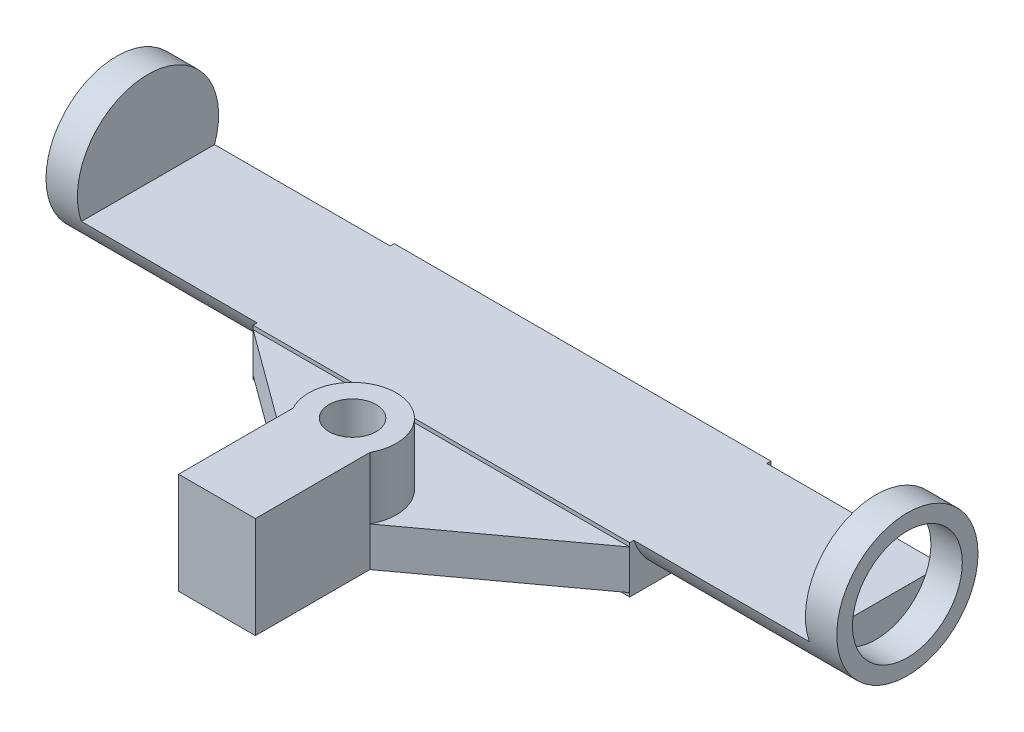
ISO-10303-21;
HEADER;
FILE_DESCRIPTION(('STEP AP214'),'2;1');
FILE_NAME('part.step','',(''),(''),'','','');
FILE_SCHEMA(('AUTOMOTIVE_DESIGN { 1 0 10303 214 1 1 1 1 }'));
ENDSEC;
DATA;
#1=APPLICATION_CONTEXT('core data for automotive mechanical design processes');
#2=APPLICATION_PROTOCOL_DEFINITION('international standard','automotive_design',2000,#1);
#3=PRODUCT_CONTEXT('',#1,'mechanical');
#4=PRODUCT('Part','Part','',(#3));
#5=PRODUCT_RELATED_PRODUCT_CATEGORY('part','',(#4));
#6=PRODUCT_DEFINITION_FORMATION('','',#4);
#7=PRODUCT_DEFINITION_CONTEXT('part definition',#1,'design');
#8=PRODUCT_DEFINITION('design','',#6,#7);
#9=PRODUCT_DEFINITION_SHAPE('','',#8);
#10=(LENGTH_UNIT() NAMED_UNIT(*) SI_UNIT(.MILLI.,.METRE.));
#11=(NAMED_UNIT(*) PLANE_ANGLE_UNIT() SI_UNIT($,.RADIAN.));
#12=(NAMED_UNIT(*) SI_UNIT($,.STERADIAN.) SOLID_ANGLE_UNIT());
#13=UNCERTAINTY_MEASURE_WITH_UNIT(LENGTH_MEASURE(1.E-05),#10,'distance_accuracy_value','');
#14=(GEOMETRIC_REPRESENTATION_CONTEXT(3) GLOBAL_UNCERTAINTY_ASSIGNED_CONTEXT((#13)) GLOBAL_UNIT_ASSIGNED_CONTEXT((#10,
#11,#12)) REPRESENTATION_CONTEXT('',''));
#15=CARTESIAN_POINT('',(0.,0.,0.));
#16=DIRECTION('',(0.,0.,1.));
#17=DIRECTION('',(1.,0.,0.));
#18=AXIS2_PLACEMENT_3D('',#15,#16,#17);
#19=CARTESIAN_POINT('',(59.217620347765,28.575,23.8423003272837));
#20=DIRECTION('',(0.,0.,-1.));
#21=DIRECTION('',(-1.,0.,0.));
#22=AXIS2_PLACEMENT_3D('',#19,#20,#21);
#23=PLANE('',#22);
#24=DIRECTION('',(0.,1.,0.));
#25=VECTOR('',#24,1.);
#26=CARTESIAN_POINT('',(-58.882379652235,28.575,23.8423003272837));
#27=LINE('',#26,#25);
#28=CARTESIAN_POINT('',(-58.882379652235,0.,23.8423003272837));
#29=VERTEX_POINT('',#28);
#30=CARTESIAN_POINT('',(-58.882379652235,0.762500000000017,23.8423003272837));
#31=VERTEX_POINT('',#30);
#32=EDGE_CURVE('E327',#29,#31,#27,.T.);
#33=ORIENTED_EDGE('',*,*,#32,.F.);
#34=DIRECTION('',(1.,0.,0.));
#35=VECTOR('',#34,1.);
#36=CARTESIAN_POINT('',(59.217620347765,0.,23.8423003272837));
#37=LINE('',#36,#35);
#38=CARTESIAN_POINT('',(17.317620347765,0.,23.8423003272837));
#39=VERTEX_POINT('',#38);
#40=EDGE_CURVE('E187',#29,#39,#37,.T.);
#41=ORIENTED_EDGE('',*,*,#40,.T.);
#42=DIRECTION('',(0.,-1.,0.));
#43=VECTOR('',#42,1.);
#44=CARTESIAN_POINT('',(17.317620347765,28.575,23.8423003272837));
#45=LINE('',#44,#43);
#46=CARTESIAN_POINT('',(17.317620347765,0.762500000000024,23.8423003272837));
#47=VERTEX_POINT('',#46);
#48=EDGE_CURVE('E216',#47,#39,#45,.T.);
#49=ORIENTED_EDGE('',*,*,#48,.F.);
#50=DIRECTION('',(1.,0.,0.));
#51=VECTOR('',#50,1.);
#52=CARTESIAN_POINT('',(17.317620347765,0.762500000000026,23.8423003272837));
#53=LINE('',#52,#51);
#54=EDGE_CURVE('E285',#31,#47,#53,.T.);
#55=ORIENTED_EDGE('',*,*,#54,.F.);
#56=EDGE_LOOP('',(#33,#41,#49,#55));
#57=FACE_BOUND('',#56,.T.);
#58=ADVANCED_FACE('F35',(#57),#23,.F.);
#59=CARTESIAN_POINT('',(-58.882379652235,8.76250000000002,23.8423003272837));
#60=VERTEX_POINT('',#59);
#61=CARTESIAN_POINT('',(-58.882379652235,9.525,23.8423003272837));
#62=VERTEX_POINT('',#61);
#63=EDGE_CURVE('E303',#60,#62,#27,.T.);
#64=ORIENTED_EDGE('',*,*,#63,.F.);
#65=DIRECTION('',(-1.,0.,0.));
#66=VECTOR('',#65,1.);
#67=CARTESIAN_POINT('',(17.317620347765,8.76250000000003,23.8423003272837));
#68=LINE('',#67,#66);
#69=CARTESIAN_POINT('',(17.317620347765,8.76250000000003,23.8423003272837));
#70=VERTEX_POINT('',#69);
#71=EDGE_CURVE('E282',#70,#60,#68,.T.);
#72=ORIENTED_EDGE('',*,*,#71,.F.);
#73=CARTESIAN_POINT('',(17.317620347765,9.525,23.8423003272837));
#74=VERTEX_POINT('',#73);
#75=EDGE_CURVE('E220',#74,#70,#45,.T.);
#76=ORIENTED_EDGE('',*,*,#75,.F.);
#77=DIRECTION('',(1.,0.,0.));
#78=VECTOR('',#77,1.);
#79=CARTESIAN_POINT('',(-94.432379652235,9.525,23.8423003272837));
#80=LINE('',#79,#78);
#81=EDGE_CURVE('E173',#62,#74,#80,.T.);
#82=ORIENTED_EDGE('',*,*,#81,.F.);
#83=EDGE_LOOP('',(#64,#72,#76,#82));
#84=FACE_BOUND('',#83,.T.);
#85=ADVANCED_FACE('F301',(#84),#23,.F.);
#86=CARTESIAN_POINT('',(59.217620347765,28.575,-4.73269967271635));
#87=DIRECTION('',(0.,0.,1.));
#88=DIRECTION('',(1.,0.,0.));
#89=AXIS2_PLACEMENT_3D('',#86,#87,#88);
#90=PLANE('',#89);
#91=DIRECTION('',(0.,-1.,0.));
#92=VECTOR('',#91,1.);
#93=CARTESIAN_POINT('',(-58.882379652235,28.575,-4.73269967271634));
#94=LINE('',#93,#92);
#95=CARTESIAN_POINT('',(-58.882379652235,9.525,-4.73269967271635));
#96=VERTEX_POINT('',#95);
#97=CARTESIAN_POINT('',(-58.882379652235,0.,-4.73269967271634));
#98=VERTEX_POINT('',#97);
#99=EDGE_CURVE('E341',#96,#98,#94,.T.);
#100=ORIENTED_EDGE('',*,*,#99,.F.);
#101=DIRECTION('',(-1.,0.,0.));
#102=VECTOR('',#101,1.);
#103=CARTESIAN_POINT('',(-94.432379652235,9.525,-4.73269967271635));
#104=LINE('',#103,#102);
#105=CARTESIAN_POINT('',(17.317620347765,9.525,-4.73269967271635));
#106=VERTEX_POINT('',#105);
#107=EDGE_CURVE('E179',#106,#96,#104,.T.);
#108=ORIENTED_EDGE('',*,*,#107,.F.);
#109=DIRECTION('',(0.,1.,0.));
#110=VECTOR('',#109,1.);
#111=CARTESIAN_POINT('',(17.317620347765,28.575,-4.73269967271635));
#112=LINE('',#111,#110);
#113=CARTESIAN_POINT('',(17.317620347765,0.,-4.73269967271635));
#114=VERTEX_POINT('',#113);
#115=EDGE_CURVE('E230',#114,#106,#112,.T.);
#116=ORIENTED_EDGE('',*,*,#115,.F.);
#117=DIRECTION('',(-1.,0.,0.));
#118=VECTOR('',#117,1.);
#119=CARTESIAN_POINT('',(59.217620347765,0.,-4.73269967271635));
#120=LINE('',#119,#118);
#121=EDGE_CURVE('E184',#114,#98,#120,.T.);
#122=ORIENTED_EDGE('',*,*,#121,.T.);
#123=EDGE_LOOP('',(#100,#108,#116,#122));
#124=FACE_BOUND('',#123,.T.);
#125=ADVANCED_FACE('F340',(#124),#90,.F.);
#126=CARTESIAN_POINT('',(0.,0.,0.));
#127=DIRECTION('',(0.,1.,0.));
#128=DIRECTION('',(0.,0.,1.));
#129=AXIS2_PLACEMENT_3D('',#126,#127,#128);
#130=PLANE('',#129);
#131=DIRECTION('',(0.,0.,1.));
#132=VECTOR('',#131,1.);
#133=CARTESIAN_POINT('',(-58.882379652235,0.,0.));
#134=LINE('',#133,#132);
#135=CARTESIAN_POINT('',(-58.882379652235,0.,9.55480032728367));
#136=VERTEX_POINT('',#135);
#137=EDGE_CURVE('E347',#98,#136,#134,.T.);
#138=ORIENTED_EDGE('',*,*,#137,.F.);
#139=ORIENTED_EDGE('',*,*,#121,.F.);
#140=DIRECTION('',(0.,0.,-1.));
#141=VECTOR('',#140,1.);
#142=CARTESIAN_POINT('',(17.317620347765,0.,0.));
#143=LINE('',#142,#141);
#144=CARTESIAN_POINT('',(17.317620347765,0.,9.55480032728365));
#145=VERTEX_POINT('',#144);
#146=EDGE_CURVE('E229',#145,#114,#143,.T.);
#147=ORIENTED_EDGE('',*,*,#146,.F.);
#148=EDGE_CURVE('E214',#39,#145,#143,.T.);
#149=ORIENTED_EDGE('',*,*,#148,.F.);
#150=ORIENTED_EDGE('',*,*,#40,.F.);
#151=EDGE_CURVE('E352',#136,#29,#134,.T.);
#152=ORIENTED_EDGE('',*,*,#151,.F.);
#153=EDGE_LOOP('',(#138,#139,#147,#149,#150,#152));
#154=FACE_BOUND('',#153,.T.);
#155=ADVANCED_FACE('F331',(#154),#130,.F.);
#156=CARTESIAN_POINT('',(0.,9.525,0.));
#157=DIRECTION('',(0.,1.,0.));
#158=DIRECTION('',(0.,0.,1.));
#159=AXIS2_PLACEMENT_3D('',#156,#157,#158);
#160=PLANE('',#159);
#161=ORIENTED_EDGE('',*,*,#107,.T.);
#162=DIRECTION('',(0.,0.,1.));
#163=VECTOR('',#162,1.);
#164=CARTESIAN_POINT('',(-58.882379652235,9.525,0.));
#165=LINE('',#164,#163);
#166=CARTESIAN_POINT('',(-58.882379652235,9.525,-3.91558385432006));
#167=VERTEX_POINT('',#166);
#168=EDGE_CURVE('E343',#96,#167,#165,.T.);
#169=ORIENTED_EDGE('',*,*,#168,.T.);
#170=DIRECTION('',(-1.,0.,0.));
#171=VECTOR('',#170,1.);
#172=CARTESIAN_POINT('',(-58.882379652235,9.525,-3.91558385432006));
#173=LINE('',#172,#171);
#174=CARTESIAN_POINT('',(-94.432379652235,9.525,-3.91558385432006));
#175=VERTEX_POINT('',#174);
#176=EDGE_CURVE('E224',#167,#175,#173,.T.);
#177=ORIENTED_EDGE('',*,*,#176,.T.);
#178=DIRECTION('',(0.,0.,1.));
#179=VECTOR('',#178,1.);
#180=CARTESIAN_POINT('',(-94.432379652235,9.525,-4.73269967271635));
#181=LINE('',#180,#179);
#182=CARTESIAN_POINT('',(-94.432379652235,9.525,23.0251845088874));
#183=VERTEX_POINT('',#182);
#184=EDGE_CURVE('E281',#175,#183,#181,.T.);
#185=ORIENTED_EDGE('',*,*,#184,.T.);
#186=DIRECTION('',(-1.,0.,0.));
#187=VECTOR('',#186,1.);
#188=CARTESIAN_POINT('',(-58.882379652235,9.525,23.0251845088874));
#189=LINE('',#188,#187);
#190=CARTESIAN_POINT('',(-58.882379652235,9.525,23.0251845088874));
#191=VERTEX_POINT('',#190);
#192=EDGE_CURVE('E353',#183,#191,#189,.F.);
#193=ORIENTED_EDGE('',*,*,#192,.T.);
#194=EDGE_CURVE('E298',#191,#62,#165,.T.);
#195=ORIENTED_EDGE('',*,*,#194,.T.);
#196=ORIENTED_EDGE('',*,*,#81,.T.);
#197=DIRECTION('',(0.,0.,-1.));
#198=VECTOR('',#197,1.);
#199=CARTESIAN_POINT('',(17.317620347765,9.525,0.));
#200=LINE('',#199,#198);
#201=CARTESIAN_POINT('',(17.317620347765,9.525,23.0251845088874));
#202=VERTEX_POINT('',#201);
#203=EDGE_CURVE('E201',#74,#202,#200,.T.);
#204=ORIENTED_EDGE('',*,*,#203,.T.);
#205=DIRECTION('',(1.,0.,0.));
#206=VECTOR('',#205,1.);
#207=CARTESIAN_POINT('',(17.317620347765,9.525,23.0251845088874));
#208=LINE('',#207,#206);
#209=CARTESIAN_POINT('',(52.867620347765,9.525,23.0251845088874));
#210=VERTEX_POINT('',#209);
#211=EDGE_CURVE('E43',#202,#210,#208,.T.);
#212=ORIENTED_EDGE('',*,*,#211,.T.);
#213=DIRECTION('',(0.,0.,-1.));
#214=VECTOR('',#213,1.);
#215=CARTESIAN_POINT('',(52.867620347765,9.525,-4.73269967271635));
#216=LINE('',#215,#214);
#217=CARTESIAN_POINT('',(52.867620347765,9.525,19.5950318983183));
#218=VERTEX_POINT('',#217);
#219=EDGE_CURVE('E175',#210,#218,#216,.T.);
#220=ORIENTED_EDGE('',*,*,#219,.T.);
#221=CARTESIAN_POINT('',(52.867620347765,9.525,-0.485431243750955));
#222=VERTEX_POINT('',#221);
#223=EDGE_CURVE('E164',#218,#222,#216,.T.);
#224=ORIENTED_EDGE('',*,*,#223,.T.);
#225=CARTESIAN_POINT('',(52.867620347765,9.525,-3.91558385432008));
#226=VERTEX_POINT('',#225);
#227=EDGE_CURVE('E167',#222,#226,#216,.T.);
#228=ORIENTED_EDGE('',*,*,#227,.T.);
#229=DIRECTION('',(1.,0.,0.));
#230=VECTOR('',#229,1.);
#231=CARTESIAN_POINT('',(17.317620347765,9.525,-3.91558385432008));
#232=LINE('',#231,#230);
#233=CARTESIAN_POINT('',(17.317620347765,9.525,-3.91558385432008));
#234=VERTEX_POINT('',#233);
#235=EDGE_CURVE('E194',#226,#234,#232,.F.);
#236=ORIENTED_EDGE('',*,*,#235,.T.);
#237=EDGE_CURVE('E232',#234,#106,#200,.T.);
#238=ORIENTED_EDGE('',*,*,#237,.T.);
#239=EDGE_LOOP('',(#161,#169,#177,#185,#193,#195,#196,#204,#212,#220,#224,#228,#236,#238));
#240=FACE_BOUND('',#239,.T.);
#241=ADVANCED_FACE('F177',(#240),#160,.T.);
#242=CARTESIAN_POINT('',(-94.432379652235,9.525,-4.73269967271635));
#243=DIRECTION('',(-1.,0.,0.));
#244=DIRECTION('',(0.,0.,1.));
#245=AXIS2_PLACEMENT_3D('',#242,#243,#244);
#246=PLANE('',#245);
#247=ORIENTED_EDGE('',*,*,#184,.F.);
#248=CARTESIAN_POINT('',(-94.432379652235,14.2875,9.55480032728367));
#249=DIRECTION('',(-1.,0.,0.));
#250=DIRECTION('',(0.,0.,1.));
#251=AXIS2_PLACEMENT_3D('',#248,#249,#250);
#252=CIRCLE('',#251,14.2875);
#253=EDGE_CURVE('E12',#183,#175,#252,.T.);
#254=ORIENTED_EDGE('',*,*,#253,.F.);
#255=EDGE_LOOP('',(#247,#254));
#256=FACE_BOUND('',#255,.T.);
#257=ADVANCED_FACE('F373',(#256),#246,.F.);
#258=CARTESIAN_POINT('',(52.867620347765,9.525,-4.73269967271635));
#259=DIRECTION('',(1.,0.,0.));
#260=DIRECTION('',(0.,0.,-1.));
#261=AXIS2_PLACEMENT_3D('',#258,#259,#260);
#262=PLANE('',#261);
#263=ORIENTED_EDGE('',*,*,#227,.F.);
#264=CARTESIAN_POINT('',(52.867620347765,14.2875,9.55480032728365));
#265=DIRECTION('',(1.,0.,0.));
#266=DIRECTION('',(0.,0.,-1.));
#267=AXIS2_PLACEMENT_3D('',#264,#265,#266);
#268=CIRCLE('',#267,11.1125);
#269=EDGE_CURVE('E152',#218,#222,#268,.F.);
#270=ORIENTED_EDGE('',*,*,#269,.F.);
#271=ORIENTED_EDGE('',*,*,#219,.F.);
#272=CARTESIAN_POINT('',(52.867620347765,14.2875,9.55480032728365));
#273=DIRECTION('',(1.,0.,0.));
#274=DIRECTION('',(0.,0.,-1.));
#275=AXIS2_PLACEMENT_3D('',#272,#273,#274);
#276=CIRCLE('',#275,14.2875);
#277=EDGE_CURVE('E169',#226,#210,#276,.T.);
#278=ORIENTED_EDGE('',*,*,#277,.F.);
#279=EDGE_LOOP('',(#263,#270,#271,#278));
#280=FACE_BOUND('',#279,.T.);
#281=ADVANCED_FACE('F168',(#280),#262,.F.);
#282=CARTESIAN_POINT('',(17.317620347765,8.76250000000003,69.2423003272837));
#283=DIRECTION('',(0.,-1.,0.));
#284=DIRECTION('',(1.,0.,0.));
#285=AXIS2_PLACEMENT_3D('',#282,#283,#284);
#286=PLANE('',#285);
#287=CARTESIAN_POINT('',(-20.782379652235,8.76250000000002,41.8150044188641));
#288=DIRECTION('',(0.,1.,0.));
#289=DIRECTION('',(-1.,0.,0.));
#290=AXIS2_PLACEMENT_3D('',#287,#288,#289);
#291=CIRCLE('',#290,8.86020409158041);
#292=CARTESIAN_POINT('',(-13.0139213717516,8.76250000000002,46.0757875028578));
#293=VERTEX_POINT('',#292);
#294=CARTESIAN_POINT('',(-28.5508379327184,8.76250000000002,46.0757875028578));
#295=VERTEX_POINT('',#294);
#296=EDGE_CURVE('E238',#293,#295,#291,.T.);
#297=ORIENTED_EDGE('',*,*,#296,.F.);
#298=DIRECTION('',(-0.806527260869814,0.,0.591196902456225));
#299=VECTOR('',#298,1.);
#300=CARTESIAN_POINT('',(17.4211471524276,8.76250000000003,23.7664135851892));
#301=LINE('',#300,#299);
#302=EDGE_CURVE('E266',#70,#293,#301,.T.);
#303=ORIENTED_EDGE('',*,*,#302,.F.);
#304=ORIENTED_EDGE('',*,*,#71,.T.);
#305=DIRECTION('',(0.806527260869815,0.,0.591196902456224));
#306=VECTOR('',#305,1.);
#307=CARTESIAN_POINT('',(-31.9486031867236,8.76250000000002,43.5851732472716));
#308=LINE('',#307,#306);
#309=EDGE_CURVE('E258',#60,#295,#308,.T.);
#310=ORIENTED_EDGE('',*,*,#309,.T.);
#311=EDGE_LOOP('',(#297,#303,#304,#310));
#312=FACE_BOUND('',#311,.T.);
#313=ADVANCED_FACE('F312',(#312),#286,.F.);
#314=CARTESIAN_POINT('',(17.317620347765,0.762500000000026,69.2423003272837));
#315=DIRECTION('',(0.,1.,0.));
#316=DIRECTION('',(-1.,0.,0.));
#317=AXIS2_PLACEMENT_3D('',#314,#315,#316);
#318=PLANE('',#317);
#319=CARTESIAN_POINT('',(-20.782379652235,0.762500000000021,41.8150044188641));
#320=DIRECTION('',(0.,1.,0.));
#321=DIRECTION('',(-1.,0.,0.));
#322=AXIS2_PLACEMENT_3D('',#319,#320,#321);
#323=CIRCLE('',#322,4.7625);
#324=CARTESIAN_POINT('',(-25.544879652235,0.762500000000021,41.8150044188641));
#325=VERTEX_POINT('',#324);
#326=EDGE_CURVE('E195',#325,#325,#323,.T.);
#327=ORIENTED_EDGE('',*,*,#326,.T.);
#328=EDGE_LOOP('',(#327));
#329=FACE_BOUND('',#328,.T.);
#330=DIRECTION('',(0.806527260869814,0.,0.591196902456224));
#331=VECTOR('',#330,1.);
#332=CARTESIAN_POINT('',(12.3321358983811,0.762500000000025,76.0436369045983));
#333=LINE('',#332,#331);
#334=CARTESIAN_POINT('',(-28.5508379327184,0.76250000000002,46.0757875028578));
#335=VERTEX_POINT('',#334);
#336=EDGE_CURVE('E264',#31,#335,#333,.T.);
#337=ORIENTED_EDGE('',*,*,#336,.F.);
#338=ORIENTED_EDGE('',*,*,#54,.T.);
#339=DIRECTION('',(-0.806527260869814,0.,0.591196902456225));
#340=VECTOR('',#339,1.);
#341=CARTESIAN_POINT('',(-4.3298450463573,0.762500000000023,39.7102258245958));
#342=LINE('',#341,#340);
#343=CARTESIAN_POINT('',(-13.0139213717516,0.762500000000024,46.0757875028578));
#344=VERTEX_POINT('',#343);
#345=EDGE_CURVE('E275',#47,#344,#342,.T.);
#346=ORIENTED_EDGE('',*,*,#345,.T.);
#347=DIRECTION('',(0.,0.,1.));
#348=VECTOR('',#347,1.);
#349=CARTESIAN_POINT('',(-13.0139213717516,0.762500000000022,69.2423003272837));
#350=LINE('',#349,#348);
#351=CARTESIAN_POINT('',(-13.0139213717516,0.762500000000017,69.2423003272837));
#352=VERTEX_POINT('',#351);
#353=EDGE_CURVE('E272',#344,#352,#350,.T.);
#354=ORIENTED_EDGE('',*,*,#353,.T.);
#355=DIRECTION('',(1.,0.,0.));
#356=VECTOR('',#355,1.);
#357=CARTESIAN_POINT('',(17.317620347765,0.762500000000026,69.2423003272837));
#358=LINE('',#357,#356);
#359=CARTESIAN_POINT('',(-28.5508379327184,0.76250000000002,69.2423003272837));
#360=VERTEX_POINT('',#359);
#361=EDGE_CURVE('E279',#360,#352,#358,.T.);
#362=ORIENTED_EDGE('',*,*,#361,.F.);
#363=DIRECTION('',(0.,0.,1.));
#364=VECTOR('',#363,1.);
#365=CARTESIAN_POINT('',(-28.5508379327184,0.76250000000002,69.2423003272837));
#366=LINE('',#365,#364);
#367=EDGE_CURVE('E57',#335,#360,#366,.T.);
#368=ORIENTED_EDGE('',*,*,#367,.F.);
#369=EDGE_LOOP('',(#337,#338,#346,#354,#362,#368));
#370=FACE_BOUND('',#369,.T.);
#371=ADVANCED_FACE('F322',(#329,#370),#318,.F.);
#372=CARTESIAN_POINT('',(0.,0.,69.2423003272837));
#373=DIRECTION('',(0.,0.,1.));
#374=DIRECTION('',(1.,0.,0.));
#375=AXIS2_PLACEMENT_3D('',#372,#373,#374);
#376=PLANE('',#375);
#377=DIRECTION('',(0.,-1.,0.));
#378=VECTOR('',#377,1.);
#379=CARTESIAN_POINT('',(-13.0139213717516,0.,69.2423003272837));
#380=LINE('',#379,#378);
#381=CARTESIAN_POINT('',(-13.0139213717516,21.2875,69.2423003272837));
#382=VERTEX_POINT('',#381);
#383=EDGE_CURVE('E189',#382,#352,#380,.T.);
#384=ORIENTED_EDGE('',*,*,#383,.F.);
#385=DIRECTION('',(1.,0.,0.));
#386=VECTOR('',#385,1.);
#387=CARTESIAN_POINT('',(-28.5508379327184,21.2875,69.2423003272837));
#388=LINE('',#387,#386);
#389=CARTESIAN_POINT('',(-28.5508379327184,21.2875,69.2423003272837));
#390=VERTEX_POINT('',#389);
#391=EDGE_CURVE('E245',#390,#382,#388,.T.);
#392=ORIENTED_EDGE('',*,*,#391,.F.);
#393=DIRECTION('',(0.,-1.,0.));
#394=VECTOR('',#393,1.);
#395=CARTESIAN_POINT('',(-28.5508379327184,0.,69.2423003272837));
#396=LINE('',#395,#394);
#397=EDGE_CURVE('E192',#390,#360,#396,.T.);
#398=ORIENTED_EDGE('',*,*,#397,.T.);
#399=ORIENTED_EDGE('',*,*,#361,.T.);
#400=EDGE_LOOP('',(#384,#392,#398,#399));
#401=FACE_BOUND('',#400,.T.);
#402=ADVANCED_FACE('F473',(#401),#376,.T.);
#403=CARTESIAN_POINT('',(17.4211471524276,0.,23.7664135851892));
#404=DIRECTION('',(-0.591196902456225,0.,-0.806527260869814));
#405=DIRECTION('',(-0.806527260869814,0.,0.591196902456225));
#406=AXIS2_PLACEMENT_3D('',#403,#404,#405);
#407=PLANE('',#406);
#408=DIRECTION('',(0.,1.,0.));
#409=VECTOR('',#408,1.);
#410=CARTESIAN_POINT('',(17.317620347765,0.762500000000026,23.8423003272837));
#411=LINE('',#410,#409);
#412=EDGE_CURVE('E288',#47,#70,#411,.T.);
#413=ORIENTED_EDGE('',*,*,#412,.T.);
#414=ORIENTED_EDGE('',*,*,#302,.T.);
#415=DIRECTION('',(0.,1.,0.));
#416=VECTOR('',#415,1.);
#417=CARTESIAN_POINT('',(-13.0139213717516,0.,46.0757875028578));
#418=LINE('',#417,#416);
#419=EDGE_CURVE('E269',#344,#293,#418,.T.);
#420=ORIENTED_EDGE('',*,*,#419,.F.);
#421=ORIENTED_EDGE('',*,*,#345,.F.);
#422=EDGE_LOOP('',(#413,#414,#420,#421));
#423=FACE_BOUND('',#422,.T.);
#424=ADVANCED_FACE('F309',(#423),#407,.F.);
#425=CARTESIAN_POINT('',(-13.0139213717516,0.,0.));
#426=DIRECTION('',(-1.,0.,0.));
#427=DIRECTION('',(0.,0.,1.));
#428=AXIS2_PLACEMENT_3D('',#425,#426,#427);
#429=PLANE('',#428);
#430=ORIENTED_EDGE('',*,*,#419,.T.);
#431=DIRECTION('',(0.,-1.,0.));
#432=VECTOR('',#431,1.);
#433=CARTESIAN_POINT('',(-13.0139213717516,21.2875,46.0757875028578));
#434=LINE('',#433,#432);
#435=CARTESIAN_POINT('',(-13.0139213717516,21.2875,46.0757875028578));
#436=VERTEX_POINT('',#435);
#437=EDGE_CURVE('E250',#436,#293,#434,.T.);
#438=ORIENTED_EDGE('',*,*,#437,.F.);
#439=DIRECTION('',(0.,0.,-1.));
#440=VECTOR('',#439,1.);
#441=CARTESIAN_POINT('',(-13.0139213717516,21.2875,69.2423003272837));
#442=LINE('',#441,#440);
#443=EDGE_CURVE('E248',#382,#436,#442,.T.);
#444=ORIENTED_EDGE('',*,*,#443,.F.);
#445=ORIENTED_EDGE('',*,*,#383,.T.);
#446=ORIENTED_EDGE('',*,*,#353,.F.);
#447=EDGE_LOOP('',(#430,#438,#444,#445,#446));
#448=FACE_BOUND('',#447,.T.);
#449=ADVANCED_FACE('F317',(#448),#429,.F.);
#450=CARTESIAN_POINT('',(-31.9486031867236,0.,43.5851732472716));
#451=DIRECTION('',(-0.591196902456224,0.,0.806527260869814));
#452=DIRECTION('',(0.806527260869814,0.,0.591196902456224));
#453=AXIS2_PLACEMENT_3D('',#450,#451,#452);
#454=PLANE('',#453);
#455=ORIENTED_EDGE('',*,*,#336,.T.);
#456=DIRECTION('',(0.,1.,0.));
#457=VECTOR('',#456,1.);
#458=CARTESIAN_POINT('',(-28.5508379327184,0.,46.0757875028578));
#459=LINE('',#458,#457);
#460=EDGE_CURVE('E261',#335,#295,#459,.T.);
#461=ORIENTED_EDGE('',*,*,#460,.T.);
#462=ORIENTED_EDGE('',*,*,#309,.F.);
#463=DIRECTION('',(0.,-1.,0.));
#464=VECTOR('',#463,1.);
#465=CARTESIAN_POINT('',(-58.882379652235,0.762500000000017,23.8423003272837));
#466=LINE('',#465,#464);
#467=EDGE_CURVE('E278',#60,#31,#466,.T.);
#468=ORIENTED_EDGE('',*,*,#467,.T.);
#469=EDGE_LOOP('',(#455,#461,#462,#468));
#470=FACE_BOUND('',#469,.T.);
#471=ADVANCED_FACE('F465',(#470),#454,.T.);
#472=CARTESIAN_POINT('',(-28.5508379327184,0.,0.));
#473=DIRECTION('',(-1.,0.,0.));
#474=DIRECTION('',(0.,0.,1.));
#475=AXIS2_PLACEMENT_3D('',#472,#473,#474);
#476=PLANE('',#475);
#477=ORIENTED_EDGE('',*,*,#367,.T.);
#478=ORIENTED_EDGE('',*,*,#397,.F.);
#479=DIRECTION('',(0.,0.,1.));
#480=VECTOR('',#479,1.);
#481=CARTESIAN_POINT('',(-28.5508379327184,21.2875,46.0757875028578));
#482=LINE('',#481,#480);
#483=CARTESIAN_POINT('',(-28.5508379327184,21.2875,46.0757875028578));
#484=VERTEX_POINT('',#483);
#485=EDGE_CURVE('E242',#484,#390,#482,.T.);
#486=ORIENTED_EDGE('',*,*,#485,.F.);
#487=DIRECTION('',(0.,-1.,0.));
#488=VECTOR('',#487,1.);
#489=CARTESIAN_POINT('',(-28.5508379327184,21.2875,46.0757875028578));
#490=LINE('',#489,#488);
#491=EDGE_CURVE('E255',#484,#295,#490,.T.);
#492=ORIENTED_EDGE('',*,*,#491,.T.);
#493=ORIENTED_EDGE('',*,*,#460,.F.);
#494=EDGE_LOOP('',(#477,#478,#486,#492,#493));
#495=FACE_BOUND('',#494,.T.);
#496=ADVANCED_FACE('F459',(#495),#476,.T.);
#497=CARTESIAN_POINT('',(-20.782379652235,21.2875,41.8150044188641));
#498=DIRECTION('',(0.,1.,0.));
#499=DIRECTION('',(-1.,0.,0.));
#500=AXIS2_PLACEMENT_3D('',#497,#498,#499);
#501=PLANE('',#500);
#502=CARTESIAN_POINT('',(-20.782379652235,21.2875,41.8150044188641));
#503=DIRECTION('',(0.,1.,0.));
#504=DIRECTION('',(-1.,0.,0.));
#505=AXIS2_PLACEMENT_3D('',#502,#503,#504);
#506=CIRCLE('',#505,8.86020409158041);
#507=EDGE_CURVE('E239',#436,#484,#506,.T.);
#508=ORIENTED_EDGE('',*,*,#507,.T.);
#509=ORIENTED_EDGE('',*,*,#485,.T.);
#510=ORIENTED_EDGE('',*,*,#391,.T.);
#511=ORIENTED_EDGE('',*,*,#443,.T.);
#512=EDGE_LOOP('',(#508,#509,#510,#511));
#513=FACE_BOUND('',#512,.T.);
#514=CARTESIAN_POINT('',(-20.782379652235,21.2875,41.8150044188641));
#515=DIRECTION('',(0.,1.,0.));
#516=DIRECTION('',(-1.,0.,0.));
#517=AXIS2_PLACEMENT_3D('',#514,#515,#516);
#518=CIRCLE('',#517,4.7625);
#519=CARTESIAN_POINT('',(-25.544879652235,21.2875,41.8150044188641));
#520=VERTEX_POINT('',#519);
#521=EDGE_CURVE('E198',#520,#520,#518,.T.);
#522=ORIENTED_EDGE('',*,*,#521,.F.);
#523=EDGE_LOOP('',(#522));
#524=FACE_BOUND('',#523,.T.);
#525=ADVANCED_FACE('F456',(#513,#524),#501,.T.);
#526=CARTESIAN_POINT('',(-20.782379652235,21.2875,41.8150044188641));
#527=DIRECTION('',(0.,-1.,0.));
#528=DIRECTION('',(1.,0.,0.));
#529=AXIS2_PLACEMENT_3D('',#526,#527,#528);
#530=CYLINDRICAL_SURFACE('',#529,8.86020409158041);
#531=ORIENTED_EDGE('',*,*,#296,.T.);
#532=ORIENTED_EDGE('',*,*,#491,.F.);
#533=ORIENTED_EDGE('',*,*,#507,.F.);
#534=ORIENTED_EDGE('',*,*,#437,.T.);
#535=EDGE_LOOP('',(#531,#532,#533,#534));
#536=FACE_BOUND('',#535,.T.);
#537=ADVANCED_FACE('F454',(#536),#530,.T.);
#538=CARTESIAN_POINT('',(-20.782379652235,21.2875,41.8150044188641));
#539=DIRECTION('',(0.,-1.,0.));
#540=DIRECTION('',(1.,0.,0.));
#541=AXIS2_PLACEMENT_3D('',#538,#539,#540);
#542=CYLINDRICAL_SURFACE('',#541,4.7625);
#543=ORIENTED_EDGE('',*,*,#521,.T.);
#544=EDGE_LOOP('',(#543));
#545=FACE_BOUND('',#544,.T.);
#546=ORIENTED_EDGE('',*,*,#326,.F.);
#547=EDGE_LOOP('',(#546));
#548=FACE_BOUND('',#547,.T.);
#549=ADVANCED_FACE('F449',(#545,#548),#542,.F.);
#550=CARTESIAN_POINT('',(17.317620347765,14.2875,9.55480032728365));
#551=DIRECTION('',(1.,0.,0.));
#552=DIRECTION('',(0.,0.,-1.));
#553=AXIS2_PLACEMENT_3D('',#550,#551,#552);
#554=CYLINDRICAL_SURFACE('',#553,14.2875);
#555=CARTESIAN_POINT('',(59.217620347765,14.2875,9.55480032728365));
#556=DIRECTION('',(1.,0.,0.));
#557=DIRECTION('',(0.,0.,-1.));
#558=AXIS2_PLACEMENT_3D('',#555,#556,#557);
#559=CIRCLE('',#558,14.2875);
#560=CARTESIAN_POINT('',(59.217620347765,14.2875,-4.73269967271635));
#561=VERTEX_POINT('',#560);
#562=EDGE_CURVE('E221',#561,#561,#559,.T.);
#563=ORIENTED_EDGE('',*,*,#562,.F.);
#564=EDGE_LOOP('',(#563));
#565=FACE_BOUND('',#564,.T.);
#566=ORIENTED_EDGE('',*,*,#277,.T.);
#567=ORIENTED_EDGE('',*,*,#211,.F.);
#568=CARTESIAN_POINT('',(17.317620347765,14.2875,9.55480032728365));
#569=DIRECTION('',(1.,0.,0.));
#570=DIRECTION('',(0.,0.,-1.));
#571=AXIS2_PLACEMENT_3D('',#568,#569,#570);
#572=CIRCLE('',#571,14.2875);
#573=EDGE_CURVE('E207',#202,#145,#572,.T.);
#574=ORIENTED_EDGE('',*,*,#573,.T.);
#575=EDGE_CURVE('E217',#145,#234,#572,.T.);
#576=ORIENTED_EDGE('',*,*,#575,.T.);
#577=ORIENTED_EDGE('',*,*,#235,.F.);
#578=EDGE_LOOP('',(#566,#567,#574,#576,#577));
#579=FACE_BOUND('',#578,.T.);
#580=ADVANCED_FACE('F205',(#565,#579),#554,.T.);
#581=CARTESIAN_POINT('',(17.317620347765,14.2875,32.2548003272836));
#582=DIRECTION('',(1.,0.,0.));
#583=DIRECTION('',(0.,0.,-1.));
#584=AXIS2_PLACEMENT_3D('',#581,#582,#583);
#585=PLANE('',#584);
#586=ORIENTED_EDGE('',*,*,#75,.T.);
#587=ORIENTED_EDGE('',*,*,#412,.F.);
#588=ORIENTED_EDGE('',*,*,#48,.T.);
#589=ORIENTED_EDGE('',*,*,#148,.T.);
#590=ORIENTED_EDGE('',*,*,#573,.F.);
#591=ORIENTED_EDGE('',*,*,#203,.F.);
#592=EDGE_LOOP('',(#586,#587,#588,#589,#590,#591));
#593=FACE_BOUND('',#592,.T.);
#594=ADVANCED_FACE('F210',(#593),#585,.T.);
#595=ORIENTED_EDGE('',*,*,#575,.F.);
#596=ORIENTED_EDGE('',*,*,#146,.T.);
#597=ORIENTED_EDGE('',*,*,#115,.T.);
#598=ORIENTED_EDGE('',*,*,#237,.F.);
#599=EDGE_LOOP('',(#595,#596,#597,#598));
#600=FACE_BOUND('',#599,.T.);
#601=ADVANCED_FACE('F336',(#600),#585,.T.);
#602=CARTESIAN_POINT('',(59.217620347765,28.575,23.8423003272837));
#603=DIRECTION('',(-1.,0.,0.));
#604=DIRECTION('',(0.,0.,1.));
#605=AXIS2_PLACEMENT_3D('',#602,#603,#604);
#606=PLANE('',#605);
#607=CARTESIAN_POINT('',(59.217620347765,14.2875,9.55480032728365));
#608=DIRECTION('',(1.,0.,0.));
#609=DIRECTION('',(0.,0.,-1.));
#610=AXIS2_PLACEMENT_3D('',#607,#608,#609);
#611=CIRCLE('',#610,11.1125);
#612=CARTESIAN_POINT('',(59.217620347765,14.2875,-1.55769967271635));
#613=VERTEX_POINT('',#612);
#614=EDGE_CURVE('E159',#613,#613,#611,.T.);
#615=ORIENTED_EDGE('',*,*,#614,.F.);
#616=EDGE_LOOP('',(#615));
#617=FACE_BOUND('',#616,.T.);
#618=ORIENTED_EDGE('',*,*,#562,.T.);
#619=EDGE_LOOP('',(#618));
#620=FACE_BOUND('',#619,.T.);
#621=ADVANCED_FACE('F37',(#617,#620),#606,.F.);
#622=CARTESIAN_POINT('',(-58.882379652235,14.2875,9.55480032728367));
#623=DIRECTION('',(-1.,0.,0.));
#624=DIRECTION('',(0.,0.,1.));
#625=AXIS2_PLACEMENT_3D('',#622,#623,#624);
#626=CYLINDRICAL_SURFACE('',#625,14.2875);
#627=CARTESIAN_POINT('',(-100.782379652235,14.2875,9.55480032728367));
#628=DIRECTION('',(-1.,0.,0.));
#629=DIRECTION('',(0.,0.,1.));
#630=AXIS2_PLACEMENT_3D('',#627,#628,#629);
#631=CIRCLE('',#630,14.2875);
#632=CARTESIAN_POINT('',(-100.782379652235,14.2875,23.8423003272837));
#633=VERTEX_POINT('',#632);
#634=EDGE_CURVE('E165',#633,#633,#631,.T.);
#635=ORIENTED_EDGE('',*,*,#634,.F.);
#636=EDGE_LOOP('',(#635));
#637=FACE_BOUND('',#636,.T.);
#638=ORIENTED_EDGE('',*,*,#253,.T.);
#639=ORIENTED_EDGE('',*,*,#176,.F.);
#640=CARTESIAN_POINT('',(-58.882379652235,14.2875,9.55480032728367));
#641=DIRECTION('',(-1.,0.,0.));
#642=DIRECTION('',(0.,0.,1.));
#643=AXIS2_PLACEMENT_3D('',#640,#641,#642);
#644=CIRCLE('',#643,14.2875);
#645=EDGE_CURVE('E355',#167,#136,#644,.T.);
#646=ORIENTED_EDGE('',*,*,#645,.T.);
#647=EDGE_CURVE('E357',#136,#191,#644,.T.);
#648=ORIENTED_EDGE('',*,*,#647,.T.);
#649=ORIENTED_EDGE('',*,*,#192,.F.);
#650=EDGE_LOOP('',(#638,#639,#646,#648,#649));
#651=FACE_BOUND('',#650,.T.);
#652=ADVANCED_FACE('F367',(#637,#651),#626,.T.);
#653=CARTESIAN_POINT('',(-58.882379652235,14.2875,32.2548003272836));
#654=DIRECTION('',(-1.,0.,0.));
#655=DIRECTION('',(0.,0.,1.));
#656=AXIS2_PLACEMENT_3D('',#653,#654,#655);
#657=PLANE('',#656);
#658=ORIENTED_EDGE('',*,*,#32,.T.);
#659=ORIENTED_EDGE('',*,*,#467,.F.);
#660=ORIENTED_EDGE('',*,*,#63,.T.);
#661=ORIENTED_EDGE('',*,*,#194,.F.);
#662=ORIENTED_EDGE('',*,*,#647,.F.);
#663=ORIENTED_EDGE('',*,*,#151,.T.);
#664=EDGE_LOOP('',(#658,#659,#660,#661,#662,#663));
#665=FACE_BOUND('',#664,.T.);
#666=ADVANCED_FACE('F369',(#665),#657,.T.);
#667=ORIENTED_EDGE('',*,*,#137,.T.);
#668=ORIENTED_EDGE('',*,*,#645,.F.);
#669=ORIENTED_EDGE('',*,*,#168,.F.);
#670=ORIENTED_EDGE('',*,*,#99,.T.);
#671=EDGE_LOOP('',(#667,#668,#669,#670));
#672=FACE_BOUND('',#671,.T.);
#673=ADVANCED_FACE('F390',(#672),#657,.T.);
#674=CARTESIAN_POINT('',(-100.782379652235,28.575,23.8423003272837));
#675=DIRECTION('',(1.,0.,0.));
#676=DIRECTION('',(0.,0.,-1.));
#677=AXIS2_PLACEMENT_3D('',#674,#675,#676);
#678=PLANE('',#677);
#679=ORIENTED_EDGE('',*,*,#634,.T.);
#680=EDGE_LOOP('',(#679));
#681=FACE_BOUND('',#680,.T.);
#682=ADVANCED_FACE('F365',(#681),#678,.F.);
#683=CARTESIAN_POINT('',(21.4367239240229,14.2875,9.55480032728365));
#684=DIRECTION('',(1.,0.,0.));
#685=DIRECTION('',(0.,0.,-1.));
#686=AXIS2_PLACEMENT_3D('',#683,#684,#685);
#687=CYLINDRICAL_SURFACE('',#686,11.1125);
#688=EDGE_CURVE('E49',#222,#218,#268,.F.);
#689=ORIENTED_EDGE('',*,*,#688,.T.);
#690=ORIENTED_EDGE('',*,*,#269,.T.);
#691=EDGE_LOOP('',(#689,#690));
#692=FACE_BOUND('',#691,.T.);
#693=ORIENTED_EDGE('',*,*,#614,.T.);
#694=EDGE_LOOP('',(#693));
#695=FACE_BOUND('',#694,.T.);
#696=ADVANCED_FACE('F153',(#692,#695),#687,.F.);
#697=CARTESIAN_POINT('',(52.867620347765,9.525,-4.73269967271635));
#698=DIRECTION('',(1.,0.,0.));
#699=DIRECTION('',(0.,0.,-1.));
#700=AXIS2_PLACEMENT_3D('',#697,#698,#699);
#701=PLANE('',#700);
#702=ORIENTED_EDGE('',*,*,#688,.F.);
#703=ORIENTED_EDGE('',*,*,#223,.F.);
#704=EDGE_LOOP('',(#702,#703));
#705=FACE_BOUND('',#704,.T.);
#706=ADVANCED_FACE('F162',(#705),#701,.T.);
#707=CLOSED_SHELL('',(#58,#85,#125,#155,#241,#257,#281,#313,#371,#402,#424,#449,#471,#496,#525,
#537,#549,#580,#594,#601,#621,#652,#666,#673,#682,#696,#706));
#708=MANIFOLD_SOLID_BREP('B2',#707);
#709=ADVANCED_BREP_SHAPE_REPRESENTATION('',(#18,#708),#14);
#710=SHAPE_DEFINITION_REPRESENTATION(#9,#709);
ENDSEC;
END-ISO-10303-21;
